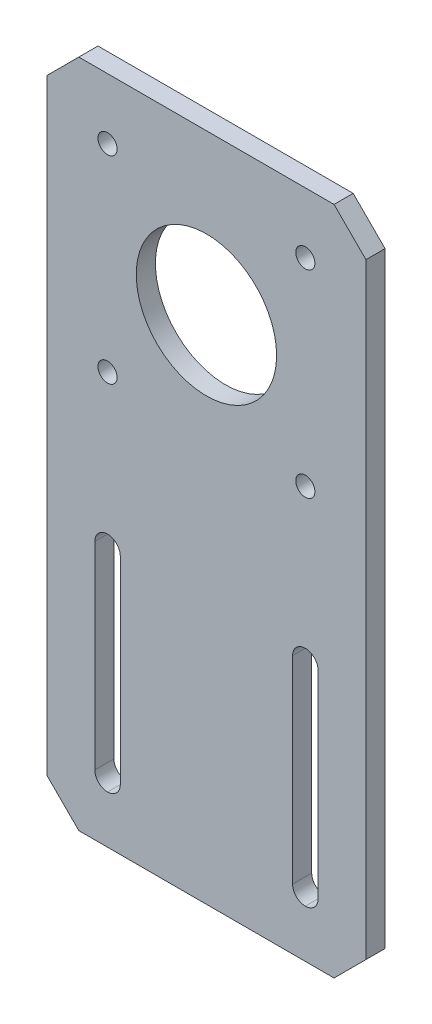
ISO-10303-21;
HEADER;
FILE_DESCRIPTION(('STEP AP214'),'2;1');
FILE_NAME('part.step','',(''),(''),'','','');
FILE_SCHEMA(('AUTOMOTIVE_DESIGN { 1 0 10303 214 1 1 1 1 }'));
ENDSEC;
DATA;
#1=APPLICATION_CONTEXT('core data for automotive mechanical design processes');
#2=APPLICATION_PROTOCOL_DEFINITION('international standard','automotive_design',2000,#1);
#3=PRODUCT_CONTEXT('',#1,'mechanical');
#4=PRODUCT('Part','Part','',(#3));
#5=PRODUCT_RELATED_PRODUCT_CATEGORY('part','',(#4));
#6=PRODUCT_DEFINITION_FORMATION('','',#4);
#7=PRODUCT_DEFINITION_CONTEXT('part definition',#1,'design');
#8=PRODUCT_DEFINITION('design','',#6,#7);
#9=PRODUCT_DEFINITION_SHAPE('','',#8);
#10=(LENGTH_UNIT() NAMED_UNIT(*) SI_UNIT(.MILLI.,.METRE.));
#11=(NAMED_UNIT(*) PLANE_ANGLE_UNIT() SI_UNIT($,.RADIAN.));
#12=(NAMED_UNIT(*) SI_UNIT($,.STERADIAN.) SOLID_ANGLE_UNIT());
#13=UNCERTAINTY_MEASURE_WITH_UNIT(LENGTH_MEASURE(1.E-05),#10,'distance_accuracy_value','');
#14=(GEOMETRIC_REPRESENTATION_CONTEXT(3) GLOBAL_UNCERTAINTY_ASSIGNED_CONTEXT((#13)) GLOBAL_UNIT_ASSIGNED_CONTEXT((#10,
#11,#12)) REPRESENTATION_CONTEXT('',''));
#15=CARTESIAN_POINT('',(0.,0.,0.));
#16=DIRECTION('',(0.,0.,1.));
#17=DIRECTION('',(1.,0.,0.));
#18=AXIS2_PLACEMENT_3D('',#15,#16,#17);
#19=CARTESIAN_POINT('',(0.,0.,3.));
#20=DIRECTION('',(0.,0.,1.));
#21=DIRECTION('',(1.,0.,0.));
#22=AXIS2_PLACEMENT_3D('',#19,#20,#21);
#23=PLANE('',#22);
#24=CARTESIAN_POINT('',(0.,0.,3.));
#25=DIRECTION('',(0.,0.,1.));
#26=DIRECTION('',(1.,0.,0.));
#27=AXIS2_PLACEMENT_3D('',#24,#25,#26);
#28=CIRCLE('',#27,11.);
#29=CARTESIAN_POINT('',(11.,0.,3.));
#30=VERTEX_POINT('',#29);
#31=EDGE_CURVE('E270',#30,#30,#28,.T.);
#32=ORIENTED_EDGE('',*,*,#31,.F.);
#33=EDGE_LOOP('',(#32));
#34=FACE_BOUND('',#33,.T.);
#35=CARTESIAN_POINT('',(15.5,-15.5,3.));
#36=DIRECTION('',(0.,0.,1.));
#37=DIRECTION('',(1.,0.,0.));
#38=AXIS2_PLACEMENT_3D('',#35,#36,#37);
#39=CIRCLE('',#38,1.50000000000013);
#40=CARTESIAN_POINT('',(17.0000000000001,-15.5,3.));
#41=VERTEX_POINT('',#40);
#42=EDGE_CURVE('E306',#41,#41,#39,.T.);
#43=ORIENTED_EDGE('',*,*,#42,.F.);
#44=EDGE_LOOP('',(#43));
#45=FACE_BOUND('',#44,.T.);
#46=CARTESIAN_POINT('',(-15.4999999999991,15.5000000000009,3.));
#47=DIRECTION('',(0.,0.,1.));
#48=DIRECTION('',(1.,0.,0.));
#49=AXIS2_PLACEMENT_3D('',#46,#47,#48);
#50=CIRCLE('',#49,1.49999999999892);
#51=CARTESIAN_POINT('',(-14.0000000000002,15.5000000000009,3.));
#52=VERTEX_POINT('',#51);
#53=EDGE_CURVE('E318',#52,#52,#50,.T.);
#54=ORIENTED_EDGE('',*,*,#53,.F.);
#55=EDGE_LOOP('',(#54));
#56=FACE_BOUND('',#55,.T.);
#57=DIRECTION('',(0.707106781186565,-0.70710678118653,0.));
#58=VECTOR('',#57,1.);
#59=CARTESIAN_POINT('',(-20.,-80.0000000000001,3.));
#60=LINE('',#59,#58);
#61=CARTESIAN_POINT('',(-25.,-75.0000000000003,3.));
#62=VERTEX_POINT('',#61);
#63=CARTESIAN_POINT('',(-20.,-80.0000000000001,3.));
#64=VERTEX_POINT('',#63);
#65=EDGE_CURVE('E187',#62,#64,#60,.T.);
#66=ORIENTED_EDGE('',*,*,#65,.T.);
#67=DIRECTION('',(1.,0.,0.));
#68=VECTOR('',#67,1.);
#69=CARTESIAN_POINT('',(-20.,-80.0000000000001,3.));
#70=LINE('',#69,#68);
#71=CARTESIAN_POINT('',(20.,-80.0000000000001,3.));
#72=VERTEX_POINT('',#71);
#73=EDGE_CURVE('E176',#64,#72,#70,.T.);
#74=ORIENTED_EDGE('',*,*,#73,.T.);
#75=DIRECTION('',(0.707106781186546,0.707106781186549,0.));
#76=VECTOR('',#75,1.);
#77=CARTESIAN_POINT('',(20.,-80.0000000000001,3.));
#78=LINE('',#77,#76);
#79=CARTESIAN_POINT('',(24.9999999999999,-75.0000000000001,3.));
#80=VERTEX_POINT('',#79);
#81=EDGE_CURVE('E186',#72,#80,#78,.T.);
#82=ORIENTED_EDGE('',*,*,#81,.T.);
#83=DIRECTION('',(0.,1.,0.));
#84=VECTOR('',#83,1.);
#85=CARTESIAN_POINT('',(24.9999999999999,-75.0000000000001,3.));
#86=LINE('',#85,#84);
#87=CARTESIAN_POINT('',(25.,20.0000000000001,3.));
#88=VERTEX_POINT('',#87);
#89=EDGE_CURVE('E324',#80,#88,#86,.T.);
#90=ORIENTED_EDGE('',*,*,#89,.T.);
#91=DIRECTION('',(-0.707106781186556,0.707106781186539,0.));
#92=VECTOR('',#91,1.);
#93=CARTESIAN_POINT('',(20.,25.,3.));
#94=LINE('',#93,#92);
#95=CARTESIAN_POINT('',(20.,25.,3.));
#96=VERTEX_POINT('',#95);
#97=EDGE_CURVE('E326',#88,#96,#94,.T.);
#98=ORIENTED_EDGE('',*,*,#97,.T.);
#99=DIRECTION('',(-1.,0.,0.));
#100=VECTOR('',#99,1.);
#101=CARTESIAN_POINT('',(-20.,25.,3.));
#102=LINE('',#101,#100);
#103=CARTESIAN_POINT('',(-20.,25.,3.));
#104=VERTEX_POINT('',#103);
#105=EDGE_CURVE('E328',#96,#104,#102,.T.);
#106=ORIENTED_EDGE('',*,*,#105,.T.);
#107=DIRECTION('',(-0.707106781186542,-0.707106781186553,0.));
#108=VECTOR('',#107,1.);
#109=CARTESIAN_POINT('',(-20.,25.,3.));
#110=LINE('',#109,#108);
#111=CARTESIAN_POINT('',(-25.,19.9999999999999,3.));
#112=VERTEX_POINT('',#111);
#113=EDGE_CURVE('E330',#104,#112,#110,.T.);
#114=ORIENTED_EDGE('',*,*,#113,.T.);
#115=DIRECTION('',(0.,-1.,0.));
#116=VECTOR('',#115,1.);
#117=CARTESIAN_POINT('',(-25.,19.9999999999999,3.));
#118=LINE('',#117,#116);
#119=EDGE_CURVE('E192',#112,#62,#118,.T.);
#120=ORIENTED_EDGE('',*,*,#119,.T.);
#121=EDGE_LOOP('',(#66,#74,#82,#90,#98,#106,#114,#120));
#122=FACE_BOUND('',#121,.T.);
#123=CARTESIAN_POINT('',(15.5000000000009,15.5,3.));
#124=DIRECTION('',(0.,0.,1.));
#125=DIRECTION('',(1.,0.,0.));
#126=AXIS2_PLACEMENT_3D('',#123,#124,#125);
#127=CIRCLE('',#126,1.49999999999981);
#128=CARTESIAN_POINT('',(17.0000000000007,15.5,3.));
#129=VERTEX_POINT('',#128);
#130=EDGE_CURVE('E312',#129,#129,#127,.T.);
#131=ORIENTED_EDGE('',*,*,#130,.F.);
#132=EDGE_LOOP('',(#131));
#133=FACE_BOUND('',#132,.T.);
#134=CARTESIAN_POINT('',(-15.5,-15.4999999999991,3.));
#135=DIRECTION('',(0.,0.,1.));
#136=DIRECTION('',(1.,0.,0.));
#137=AXIS2_PLACEMENT_3D('',#134,#135,#136);
#138=CIRCLE('',#137,1.49999999999938);
#139=CARTESIAN_POINT('',(-14.0000000000006,-15.4999999999991,3.));
#140=VERTEX_POINT('',#139);
#141=EDGE_CURVE('E300',#140,#140,#138,.T.);
#142=ORIENTED_EDGE('',*,*,#141,.F.);
#143=EDGE_LOOP('',(#142));
#144=FACE_BOUND('',#143,.T.);
#145=CARTESIAN_POINT('',(-15.5,-39.5,3.));
#146=DIRECTION('',(0.,0.,1.));
#147=DIRECTION('',(1.,0.,0.));
#148=AXIS2_PLACEMENT_3D('',#145,#146,#147);
#149=CIRCLE('',#148,2.);
#150=CARTESIAN_POINT('',(-17.5,-39.5,3.));
#151=VERTEX_POINT('',#150);
#152=CARTESIAN_POINT('',(-15.5,-37.5,3.));
#153=VERTEX_POINT('',#152);
#154=EDGE_CURVE('E54',#151,#153,#149,.F.);
#155=ORIENTED_EDGE('',*,*,#154,.T.);
#156=CARTESIAN_POINT('',(-15.5,-39.5,3.));
#157=DIRECTION('',(0.,0.,1.));
#158=DIRECTION('',(1.,0.,0.));
#159=AXIS2_PLACEMENT_3D('',#156,#157,#158);
#160=CIRCLE('',#159,2.);
#161=CARTESIAN_POINT('',(-13.5,-39.5,3.));
#162=VERTEX_POINT('',#161);
#163=EDGE_CURVE('E11',#153,#162,#160,.F.);
#164=ORIENTED_EDGE('',*,*,#163,.T.);
#165=DIRECTION('',(0.,1.,0.));
#166=VECTOR('',#165,1.);
#167=CARTESIAN_POINT('',(-13.5,-37.5,3.));
#168=LINE('',#167,#166);
#169=CARTESIAN_POINT('',(-13.5,-70.5,3.));
#170=VERTEX_POINT('',#169);
#171=EDGE_CURVE('E292',#170,#162,#168,.T.);
#172=ORIENTED_EDGE('',*,*,#171,.F.);
#173=CARTESIAN_POINT('',(-15.5,-70.5,3.));
#174=DIRECTION('',(0.,0.,1.));
#175=DIRECTION('',(1.,0.,0.));
#176=AXIS2_PLACEMENT_3D('',#173,#174,#175);
#177=CIRCLE('',#176,2.);
#178=CARTESIAN_POINT('',(-15.5,-72.5,3.));
#179=VERTEX_POINT('',#178);
#180=EDGE_CURVE('E232',#170,#179,#177,.F.);
#181=ORIENTED_EDGE('',*,*,#180,.T.);
#182=CARTESIAN_POINT('',(-15.5,-70.5,3.));
#183=DIRECTION('',(0.,0.,1.));
#184=DIRECTION('',(1.,0.,0.));
#185=AXIS2_PLACEMENT_3D('',#182,#183,#184);
#186=CIRCLE('',#185,2.);
#187=CARTESIAN_POINT('',(-17.5,-70.5,3.));
#188=VERTEX_POINT('',#187);
#189=EDGE_CURVE('E243',#179,#188,#186,.F.);
#190=ORIENTED_EDGE('',*,*,#189,.T.);
#191=DIRECTION('',(0.,-1.,0.));
#192=VECTOR('',#191,1.);
#193=CARTESIAN_POINT('',(-17.5,-37.5,3.));
#194=LINE('',#193,#192);
#195=EDGE_CURVE('E289',#151,#188,#194,.T.);
#196=ORIENTED_EDGE('',*,*,#195,.F.);
#197=EDGE_LOOP('',(#155,#164,#172,#181,#190,#196));
#198=FACE_BOUND('',#197,.T.);
#199=CARTESIAN_POINT('',(15.5,-70.5,3.));
#200=DIRECTION('',(0.,0.,1.));
#201=DIRECTION('',(1.,0.,0.));
#202=AXIS2_PLACEMENT_3D('',#199,#200,#201);
#203=CIRCLE('',#202,2.);
#204=CARTESIAN_POINT('',(17.5,-70.5,3.));
#205=VERTEX_POINT('',#204);
#206=CARTESIAN_POINT('',(15.5,-72.5,3.));
#207=VERTEX_POINT('',#206);
#208=EDGE_CURVE('E228',#205,#207,#203,.F.);
#209=ORIENTED_EDGE('',*,*,#208,.T.);
#210=CARTESIAN_POINT('',(15.5,-70.5,3.));
#211=DIRECTION('',(0.,0.,1.));
#212=DIRECTION('',(1.,0.,0.));
#213=AXIS2_PLACEMENT_3D('',#210,#211,#212);
#214=CIRCLE('',#213,2.);
#215=CARTESIAN_POINT('',(13.5,-70.5,3.));
#216=VERTEX_POINT('',#215);
#217=EDGE_CURVE('E247',#207,#216,#214,.F.);
#218=ORIENTED_EDGE('',*,*,#217,.T.);
#219=DIRECTION('',(0.,-1.,0.));
#220=VECTOR('',#219,1.);
#221=CARTESIAN_POINT('',(13.5,-37.5,3.));
#222=LINE('',#221,#220);
#223=CARTESIAN_POINT('',(13.5,-39.5,3.));
#224=VERTEX_POINT('',#223);
#225=EDGE_CURVE('E280',#224,#216,#222,.T.);
#226=ORIENTED_EDGE('',*,*,#225,.F.);
#227=CARTESIAN_POINT('',(15.5,-39.5,3.));
#228=DIRECTION('',(0.,0.,1.));
#229=DIRECTION('',(1.,0.,0.));
#230=AXIS2_PLACEMENT_3D('',#227,#228,#229);
#231=CIRCLE('',#230,2.);
#232=CARTESIAN_POINT('',(15.5,-37.5,3.));
#233=VERTEX_POINT('',#232);
#234=EDGE_CURVE('E236',#224,#233,#231,.F.);
#235=ORIENTED_EDGE('',*,*,#234,.T.);
#236=CARTESIAN_POINT('',(15.5,-39.5,3.));
#237=DIRECTION('',(0.,0.,1.));
#238=DIRECTION('',(1.,0.,0.));
#239=AXIS2_PLACEMENT_3D('',#236,#237,#238);
#240=CIRCLE('',#239,2.);
#241=CARTESIAN_POINT('',(17.5,-39.5,3.));
#242=VERTEX_POINT('',#241);
#243=EDGE_CURVE('E251',#233,#242,#240,.F.);
#244=ORIENTED_EDGE('',*,*,#243,.T.);
#245=DIRECTION('',(0.,1.,0.));
#246=VECTOR('',#245,1.);
#247=CARTESIAN_POINT('',(17.5,-72.5,3.));
#248=LINE('',#247,#246);
#249=EDGE_CURVE('E277',#205,#242,#248,.T.);
#250=ORIENTED_EDGE('',*,*,#249,.F.);
#251=EDGE_LOOP('',(#209,#218,#226,#235,#244,#250));
#252=FACE_BOUND('',#251,.T.);
#253=ADVANCED_FACE('F38',(#34,#45,#56,#122,#133,#144,#198,#252),#23,.T.);
#254=CARTESIAN_POINT('',(0.,0.,0.));
#255=DIRECTION('',(0.,0.,1.));
#256=DIRECTION('',(1.,0.,0.));
#257=AXIS2_PLACEMENT_3D('',#254,#255,#256);
#258=PLANE('',#257);
#259=CARTESIAN_POINT('',(0.,0.,0.));
#260=DIRECTION('',(0.,0.,1.));
#261=DIRECTION('',(1.,0.,0.));
#262=AXIS2_PLACEMENT_3D('',#259,#260,#261);
#263=CIRCLE('',#262,11.);
#264=CARTESIAN_POINT('',(11.,0.,0.));
#265=VERTEX_POINT('',#264);
#266=EDGE_CURVE('E266',#265,#265,#263,.T.);
#267=ORIENTED_EDGE('',*,*,#266,.T.);
#268=EDGE_LOOP('',(#267));
#269=FACE_BOUND('',#268,.T.);
#270=DIRECTION('',(0.,1.,0.));
#271=VECTOR('',#270,1.);
#272=CARTESIAN_POINT('',(-13.5,-37.5,0.));
#273=LINE('',#272,#271);
#274=CARTESIAN_POINT('',(-13.5,-70.5,0.));
#275=VERTEX_POINT('',#274);
#276=CARTESIAN_POINT('',(-13.5,-39.5,0.));
#277=VERTEX_POINT('',#276);
#278=EDGE_CURVE('E293',#275,#277,#273,.T.);
#279=ORIENTED_EDGE('',*,*,#278,.T.);
#280=CARTESIAN_POINT('',(-15.5,-39.5,0.));
#281=DIRECTION('',(0.,0.,1.));
#282=DIRECTION('',(1.,0.,0.));
#283=AXIS2_PLACEMENT_3D('',#280,#281,#282);
#284=CIRCLE('',#283,2.);
#285=CARTESIAN_POINT('',(-15.5,-37.5,0.));
#286=VERTEX_POINT('',#285);
#287=EDGE_CURVE('E47',#277,#286,#284,.T.);
#288=ORIENTED_EDGE('',*,*,#287,.T.);
#289=CARTESIAN_POINT('',(-15.5,-39.5,0.));
#290=DIRECTION('',(0.,0.,1.));
#291=DIRECTION('',(1.,0.,0.));
#292=AXIS2_PLACEMENT_3D('',#289,#290,#291);
#293=CIRCLE('',#292,2.);
#294=CARTESIAN_POINT('',(-17.5,-39.5,0.));
#295=VERTEX_POINT('',#294);
#296=EDGE_CURVE('E238',#286,#295,#293,.T.);
#297=ORIENTED_EDGE('',*,*,#296,.T.);
#298=DIRECTION('',(0.,-1.,0.));
#299=VECTOR('',#298,1.);
#300=CARTESIAN_POINT('',(-17.5,-37.5,0.));
#301=LINE('',#300,#299);
#302=CARTESIAN_POINT('',(-17.5,-70.5,0.));
#303=VERTEX_POINT('',#302);
#304=EDGE_CURVE('E284',#295,#303,#301,.T.);
#305=ORIENTED_EDGE('',*,*,#304,.T.);
#306=CARTESIAN_POINT('',(-15.5,-70.5,0.));
#307=DIRECTION('',(0.,0.,1.));
#308=DIRECTION('',(1.,0.,0.));
#309=AXIS2_PLACEMENT_3D('',#306,#307,#308);
#310=CIRCLE('',#309,2.);
#311=CARTESIAN_POINT('',(-15.5,-72.5,0.));
#312=VERTEX_POINT('',#311);
#313=EDGE_CURVE('E241',#303,#312,#310,.T.);
#314=ORIENTED_EDGE('',*,*,#313,.T.);
#315=CARTESIAN_POINT('',(-15.5,-70.5,0.));
#316=DIRECTION('',(0.,0.,1.));
#317=DIRECTION('',(1.,0.,0.));
#318=AXIS2_PLACEMENT_3D('',#315,#316,#317);
#319=CIRCLE('',#318,2.);
#320=EDGE_CURVE('E230',#312,#275,#319,.T.);
#321=ORIENTED_EDGE('',*,*,#320,.T.);
#322=EDGE_LOOP('',(#279,#288,#297,#305,#314,#321));
#323=FACE_BOUND('',#322,.T.);
#324=DIRECTION('',(0.707106781186565,-0.70710678118653,0.));
#325=VECTOR('',#324,1.);
#326=CARTESIAN_POINT('',(-20.,-80.0000000000001,0.));
#327=LINE('',#326,#325);
#328=CARTESIAN_POINT('',(-25.,-75.0000000000003,0.));
#329=VERTEX_POINT('',#328);
#330=CARTESIAN_POINT('',(-20.,-80.0000000000001,0.));
#331=VERTEX_POINT('',#330);
#332=EDGE_CURVE('E200',#329,#331,#327,.T.);
#333=ORIENTED_EDGE('',*,*,#332,.F.);
#334=DIRECTION('',(0.,-1.,0.));
#335=VECTOR('',#334,1.);
#336=CARTESIAN_POINT('',(-25.,19.9999999999999,0.));
#337=LINE('',#336,#335);
#338=CARTESIAN_POINT('',(-25.,19.9999999999999,0.));
#339=VERTEX_POINT('',#338);
#340=EDGE_CURVE('E196',#339,#329,#337,.T.);
#341=ORIENTED_EDGE('',*,*,#340,.F.);
#342=DIRECTION('',(-0.707106781186542,-0.707106781186553,0.));
#343=VECTOR('',#342,1.);
#344=CARTESIAN_POINT('',(-20.,25.,0.));
#345=LINE('',#344,#343);
#346=CARTESIAN_POINT('',(-20.,25.,0.));
#347=VERTEX_POINT('',#346);
#348=EDGE_CURVE('E345',#347,#339,#345,.T.);
#349=ORIENTED_EDGE('',*,*,#348,.F.);
#350=DIRECTION('',(-1.,0.,0.));
#351=VECTOR('',#350,1.);
#352=CARTESIAN_POINT('',(-20.,25.,0.));
#353=LINE('',#352,#351);
#354=CARTESIAN_POINT('',(20.,25.,0.));
#355=VERTEX_POINT('',#354);
#356=EDGE_CURVE('E343',#355,#347,#353,.T.);
#357=ORIENTED_EDGE('',*,*,#356,.F.);
#358=DIRECTION('',(-0.707106781186556,0.707106781186539,0.));
#359=VECTOR('',#358,1.);
#360=CARTESIAN_POINT('',(20.,25.,0.));
#361=LINE('',#360,#359);
#362=CARTESIAN_POINT('',(25.,20.0000000000001,0.));
#363=VERTEX_POINT('',#362);
#364=EDGE_CURVE('E341',#363,#355,#361,.T.);
#365=ORIENTED_EDGE('',*,*,#364,.F.);
#366=DIRECTION('',(0.,1.,0.));
#367=VECTOR('',#366,1.);
#368=CARTESIAN_POINT('',(24.9999999999999,-75.0000000000001,0.));
#369=LINE('',#368,#367);
#370=CARTESIAN_POINT('',(24.9999999999999,-75.0000000000001,0.));
#371=VERTEX_POINT('',#370);
#372=EDGE_CURVE('E339',#371,#363,#369,.T.);
#373=ORIENTED_EDGE('',*,*,#372,.F.);
#374=DIRECTION('',(0.707106781186546,0.707106781186549,0.));
#375=VECTOR('',#374,1.);
#376=CARTESIAN_POINT('',(20.,-80.0000000000001,0.));
#377=LINE('',#376,#375);
#378=CARTESIAN_POINT('',(20.,-80.0000000000001,0.));
#379=VERTEX_POINT('',#378);
#380=EDGE_CURVE('E337',#379,#371,#377,.T.);
#381=ORIENTED_EDGE('',*,*,#380,.F.);
#382=DIRECTION('',(1.,0.,0.));
#383=VECTOR('',#382,1.);
#384=CARTESIAN_POINT('',(-20.,-80.0000000000001,0.));
#385=LINE('',#384,#383);
#386=EDGE_CURVE('E335',#331,#379,#385,.T.);
#387=ORIENTED_EDGE('',*,*,#386,.F.);
#388=EDGE_LOOP('',(#333,#341,#349,#357,#365,#373,#381,#387));
#389=FACE_BOUND('',#388,.T.);
#390=CARTESIAN_POINT('',(-15.4999999999991,15.5000000000009,0.));
#391=DIRECTION('',(0.,0.,1.));
#392=DIRECTION('',(1.,0.,0.));
#393=AXIS2_PLACEMENT_3D('',#390,#391,#392);
#394=CIRCLE('',#393,1.49999999999892);
#395=CARTESIAN_POINT('',(-14.0000000000002,15.5000000000009,0.));
#396=VERTEX_POINT('',#395);
#397=EDGE_CURVE('E315',#396,#396,#394,.T.);
#398=ORIENTED_EDGE('',*,*,#397,.T.);
#399=EDGE_LOOP('',(#398));
#400=FACE_BOUND('',#399,.T.);
#401=CARTESIAN_POINT('',(15.5000000000009,15.5,0.));
#402=DIRECTION('',(0.,0.,1.));
#403=DIRECTION('',(1.,0.,0.));
#404=AXIS2_PLACEMENT_3D('',#401,#402,#403);
#405=CIRCLE('',#404,1.49999999999981);
#406=CARTESIAN_POINT('',(17.0000000000007,15.5,0.));
#407=VERTEX_POINT('',#406);
#408=EDGE_CURVE('E309',#407,#407,#405,.T.);
#409=ORIENTED_EDGE('',*,*,#408,.T.);
#410=EDGE_LOOP('',(#409));
#411=FACE_BOUND('',#410,.T.);
#412=CARTESIAN_POINT('',(15.5,-15.5,0.));
#413=DIRECTION('',(0.,0.,1.));
#414=DIRECTION('',(1.,0.,0.));
#415=AXIS2_PLACEMENT_3D('',#412,#413,#414);
#416=CIRCLE('',#415,1.50000000000013);
#417=CARTESIAN_POINT('',(17.0000000000001,-15.5,0.));
#418=VERTEX_POINT('',#417);
#419=EDGE_CURVE('E303',#418,#418,#416,.T.);
#420=ORIENTED_EDGE('',*,*,#419,.T.);
#421=EDGE_LOOP('',(#420));
#422=FACE_BOUND('',#421,.T.);
#423=CARTESIAN_POINT('',(-15.5,-15.4999999999991,0.));
#424=DIRECTION('',(0.,0.,1.));
#425=DIRECTION('',(1.,0.,0.));
#426=AXIS2_PLACEMENT_3D('',#423,#424,#425);
#427=CIRCLE('',#426,1.49999999999938);
#428=CARTESIAN_POINT('',(-14.0000000000006,-15.4999999999991,0.));
#429=VERTEX_POINT('',#428);
#430=EDGE_CURVE('E296',#429,#429,#427,.T.);
#431=ORIENTED_EDGE('',*,*,#430,.T.);
#432=EDGE_LOOP('',(#431));
#433=FACE_BOUND('',#432,.T.);
#434=DIRECTION('',(0.,-1.,0.));
#435=VECTOR('',#434,1.);
#436=CARTESIAN_POINT('',(13.5,-37.5,0.));
#437=LINE('',#436,#435);
#438=CARTESIAN_POINT('',(13.5,-39.5,0.));
#439=VERTEX_POINT('',#438);
#440=CARTESIAN_POINT('',(13.5,-70.5,0.));
#441=VERTEX_POINT('',#440);
#442=EDGE_CURVE('E281',#439,#441,#437,.T.);
#443=ORIENTED_EDGE('',*,*,#442,.T.);
#444=CARTESIAN_POINT('',(15.5,-70.5,0.));
#445=DIRECTION('',(0.,0.,1.));
#446=DIRECTION('',(1.,0.,0.));
#447=AXIS2_PLACEMENT_3D('',#444,#445,#446);
#448=CIRCLE('',#447,2.);
#449=CARTESIAN_POINT('',(15.5,-72.5,0.));
#450=VERTEX_POINT('',#449);
#451=EDGE_CURVE('E245',#441,#450,#448,.T.);
#452=ORIENTED_EDGE('',*,*,#451,.T.);
#453=CARTESIAN_POINT('',(15.5,-70.5,0.));
#454=DIRECTION('',(0.,0.,1.));
#455=DIRECTION('',(1.,0.,0.));
#456=AXIS2_PLACEMENT_3D('',#453,#454,#455);
#457=CIRCLE('',#456,2.);
#458=CARTESIAN_POINT('',(17.5,-70.5,0.));
#459=VERTEX_POINT('',#458);
#460=EDGE_CURVE('E226',#450,#459,#457,.T.);
#461=ORIENTED_EDGE('',*,*,#460,.T.);
#462=DIRECTION('',(0.,1.,0.));
#463=VECTOR('',#462,1.);
#464=CARTESIAN_POINT('',(17.5,-72.5,0.));
#465=LINE('',#464,#463);
#466=CARTESIAN_POINT('',(17.5,-39.5,0.));
#467=VERTEX_POINT('',#466);
#468=EDGE_CURVE('E257',#459,#467,#465,.T.);
#469=ORIENTED_EDGE('',*,*,#468,.T.);
#470=CARTESIAN_POINT('',(15.5,-39.5,0.));
#471=DIRECTION('',(0.,0.,1.));
#472=DIRECTION('',(1.,0.,0.));
#473=AXIS2_PLACEMENT_3D('',#470,#471,#472);
#474=CIRCLE('',#473,2.);
#475=CARTESIAN_POINT('',(15.5,-37.5,0.));
#476=VERTEX_POINT('',#475);
#477=EDGE_CURVE('E249',#467,#476,#474,.T.);
#478=ORIENTED_EDGE('',*,*,#477,.T.);
#479=CARTESIAN_POINT('',(15.5,-39.5,0.));
#480=DIRECTION('',(0.,0.,1.));
#481=DIRECTION('',(1.,0.,0.));
#482=AXIS2_PLACEMENT_3D('',#479,#480,#481);
#483=CIRCLE('',#482,2.);
#484=EDGE_CURVE('E234',#476,#439,#483,.T.);
#485=ORIENTED_EDGE('',*,*,#484,.T.);
#486=EDGE_LOOP('',(#443,#452,#461,#469,#478,#485));
#487=FACE_BOUND('',#486,.T.);
#488=ADVANCED_FACE('F371',(#269,#323,#389,#400,#411,#422,#433,#487),#258,.F.);
#489=CARTESIAN_POINT('',(-20.,-80.0000000000001,3.));
#490=DIRECTION('',(0.70710678118653,0.707106781186565,0.));
#491=DIRECTION('',(-0.707106781186565,0.70710678118653,0.));
#492=AXIS2_PLACEMENT_3D('',#489,#490,#491);
#493=PLANE('',#492);
#494=ORIENTED_EDGE('',*,*,#332,.T.);
#495=DIRECTION('',(0.,0.,-1.));
#496=VECTOR('',#495,1.);
#497=CARTESIAN_POINT('',(-20.,-80.0000000000001,3.));
#498=LINE('',#497,#496);
#499=EDGE_CURVE('E180',#64,#331,#498,.T.);
#500=ORIENTED_EDGE('',*,*,#499,.F.);
#501=ORIENTED_EDGE('',*,*,#65,.F.);
#502=DIRECTION('',(0.,0.,-1.));
#503=VECTOR('',#502,1.);
#504=CARTESIAN_POINT('',(-25.,-75.0000000000003,3.));
#505=LINE('',#504,#503);
#506=EDGE_CURVE('E333',#62,#329,#505,.T.);
#507=ORIENTED_EDGE('',*,*,#506,.T.);
#508=EDGE_LOOP('',(#494,#500,#501,#507));
#509=FACE_BOUND('',#508,.T.);
#510=ADVANCED_FACE('F198',(#509),#493,.F.);
#511=CARTESIAN_POINT('',(-20.,-80.0000000000001,3.));
#512=DIRECTION('',(0.,1.,0.));
#513=DIRECTION('',(0.,0.,1.));
#514=AXIS2_PLACEMENT_3D('',#511,#512,#513);
#515=PLANE('',#514);
#516=ORIENTED_EDGE('',*,*,#386,.T.);
#517=DIRECTION('',(0.,0.,-1.));
#518=VECTOR('',#517,1.);
#519=CARTESIAN_POINT('',(20.,-80.0000000000001,3.));
#520=LINE('',#519,#518);
#521=EDGE_CURVE('E183',#72,#379,#520,.T.);
#522=ORIENTED_EDGE('',*,*,#521,.F.);
#523=ORIENTED_EDGE('',*,*,#73,.F.);
#524=ORIENTED_EDGE('',*,*,#499,.T.);
#525=EDGE_LOOP('',(#516,#522,#523,#524));
#526=FACE_BOUND('',#525,.T.);
#527=ADVANCED_FACE('F178',(#526),#515,.F.);
#528=CARTESIAN_POINT('',(20.,-80.0000000000001,3.));
#529=DIRECTION('',(-0.707106781186549,0.707106781186546,0.));
#530=DIRECTION('',(-0.707106781186546,-0.707106781186549,0.));
#531=AXIS2_PLACEMENT_3D('',#528,#529,#530);
#532=PLANE('',#531);
#533=ORIENTED_EDGE('',*,*,#380,.T.);
#534=DIRECTION('',(0.,0.,-1.));
#535=VECTOR('',#534,1.);
#536=CARTESIAN_POINT('',(24.9999999999999,-75.0000000000001,3.));
#537=LINE('',#536,#535);
#538=EDGE_CURVE('E205',#80,#371,#537,.T.);
#539=ORIENTED_EDGE('',*,*,#538,.F.);
#540=ORIENTED_EDGE('',*,*,#81,.F.);
#541=ORIENTED_EDGE('',*,*,#521,.T.);
#542=EDGE_LOOP('',(#533,#539,#540,#541));
#543=FACE_BOUND('',#542,.T.);
#544=ADVANCED_FACE('F385',(#543),#532,.F.);
#545=CARTESIAN_POINT('',(24.9999999999999,-75.0000000000001,3.));
#546=DIRECTION('',(-1.,0.,0.));
#547=DIRECTION('',(0.,-1.,0.));
#548=AXIS2_PLACEMENT_3D('',#545,#546,#547);
#549=PLANE('',#548);
#550=ORIENTED_EDGE('',*,*,#372,.T.);
#551=DIRECTION('',(0.,0.,-1.));
#552=VECTOR('',#551,1.);
#553=CARTESIAN_POINT('',(25.,20.0000000000001,3.));
#554=LINE('',#553,#552);
#555=EDGE_CURVE('E358',#88,#363,#554,.T.);
#556=ORIENTED_EDGE('',*,*,#555,.F.);
#557=ORIENTED_EDGE('',*,*,#89,.F.);
#558=ORIENTED_EDGE('',*,*,#538,.T.);
#559=EDGE_LOOP('',(#550,#556,#557,#558));
#560=FACE_BOUND('',#559,.T.);
#561=ADVANCED_FACE('F365',(#560),#549,.F.);
#562=CARTESIAN_POINT('',(20.,25.,3.));
#563=DIRECTION('',(-0.707106781186539,-0.707106781186556,0.));
#564=DIRECTION('',(0.707106781186556,-0.707106781186539,0.));
#565=AXIS2_PLACEMENT_3D('',#562,#563,#564);
#566=PLANE('',#565);
#567=ORIENTED_EDGE('',*,*,#364,.T.);
#568=DIRECTION('',(0.,0.,-1.));
#569=VECTOR('',#568,1.);
#570=CARTESIAN_POINT('',(20.,25.,3.));
#571=LINE('',#570,#569);
#572=EDGE_CURVE('E355',#96,#355,#571,.T.);
#573=ORIENTED_EDGE('',*,*,#572,.F.);
#574=ORIENTED_EDGE('',*,*,#97,.F.);
#575=ORIENTED_EDGE('',*,*,#555,.T.);
#576=EDGE_LOOP('',(#567,#573,#574,#575));
#577=FACE_BOUND('',#576,.T.);
#578=ADVANCED_FACE('F377',(#577),#566,.F.);
#579=CARTESIAN_POINT('',(-20.,25.,3.));
#580=DIRECTION('',(0.,-1.,0.));
#581=DIRECTION('',(0.,0.,-1.));
#582=AXIS2_PLACEMENT_3D('',#579,#580,#581);
#583=PLANE('',#582);
#584=ORIENTED_EDGE('',*,*,#356,.T.);
#585=DIRECTION('',(0.,0.,-1.));
#586=VECTOR('',#585,1.);
#587=CARTESIAN_POINT('',(-20.,25.,3.));
#588=LINE('',#587,#586);
#589=EDGE_CURVE('E352',#104,#347,#588,.T.);
#590=ORIENTED_EDGE('',*,*,#589,.F.);
#591=ORIENTED_EDGE('',*,*,#105,.F.);
#592=ORIENTED_EDGE('',*,*,#572,.T.);
#593=EDGE_LOOP('',(#584,#590,#591,#592));
#594=FACE_BOUND('',#593,.T.);
#595=ADVANCED_FACE('F381',(#594),#583,.F.);
#596=CARTESIAN_POINT('',(-20.,25.,3.));
#597=DIRECTION('',(0.707106781186553,-0.707106781186542,0.));
#598=DIRECTION('',(0.707106781186542,0.707106781186553,0.));
#599=AXIS2_PLACEMENT_3D('',#596,#597,#598);
#600=PLANE('',#599);
#601=ORIENTED_EDGE('',*,*,#348,.T.);
#602=DIRECTION('',(0.,0.,-1.));
#603=VECTOR('',#602,1.);
#604=CARTESIAN_POINT('',(-25.,19.9999999999999,3.));
#605=LINE('',#604,#603);
#606=EDGE_CURVE('E349',#112,#339,#605,.T.);
#607=ORIENTED_EDGE('',*,*,#606,.F.);
#608=ORIENTED_EDGE('',*,*,#113,.F.);
#609=ORIENTED_EDGE('',*,*,#589,.T.);
#610=EDGE_LOOP('',(#601,#607,#608,#609));
#611=FACE_BOUND('',#610,.T.);
#612=ADVANCED_FACE('F410',(#611),#600,.F.);
#613=CARTESIAN_POINT('',(-25.,19.9999999999999,3.));
#614=DIRECTION('',(1.,0.,0.));
#615=DIRECTION('',(0.,1.,0.));
#616=AXIS2_PLACEMENT_3D('',#613,#614,#615);
#617=PLANE('',#616);
#618=ORIENTED_EDGE('',*,*,#340,.T.);
#619=ORIENTED_EDGE('',*,*,#506,.F.);
#620=ORIENTED_EDGE('',*,*,#119,.F.);
#621=ORIENTED_EDGE('',*,*,#606,.T.);
#622=EDGE_LOOP('',(#618,#619,#620,#621));
#623=FACE_BOUND('',#622,.T.);
#624=ADVANCED_FACE('F407',(#623),#617,.F.);
#625=CARTESIAN_POINT('',(-15.4999999999991,15.5000000000009,3.));
#626=DIRECTION('',(0.,0.,-1.));
#627=DIRECTION('',(-1.,0.,0.));
#628=AXIS2_PLACEMENT_3D('',#625,#626,#627);
#629=CYLINDRICAL_SURFACE('',#628,1.49999999999892);
#630=ORIENTED_EDGE('',*,*,#53,.T.);
#631=EDGE_LOOP('',(#630));
#632=FACE_BOUND('',#631,.T.);
#633=ORIENTED_EDGE('',*,*,#397,.F.);
#634=EDGE_LOOP('',(#633));
#635=FACE_BOUND('',#634,.T.);
#636=ADVANCED_FACE('F404',(#632,#635),#629,.F.);
#637=CARTESIAN_POINT('',(15.5000000000009,15.5,3.));
#638=DIRECTION('',(0.,0.,-1.));
#639=DIRECTION('',(-1.,0.,0.));
#640=AXIS2_PLACEMENT_3D('',#637,#638,#639);
#641=CYLINDRICAL_SURFACE('',#640,1.49999999999981);
#642=ORIENTED_EDGE('',*,*,#130,.T.);
#643=EDGE_LOOP('',(#642));
#644=FACE_BOUND('',#643,.T.);
#645=ORIENTED_EDGE('',*,*,#408,.F.);
#646=EDGE_LOOP('',(#645));
#647=FACE_BOUND('',#646,.T.);
#648=ADVANCED_FACE('F440',(#644,#647),#641,.F.);
#649=CARTESIAN_POINT('',(15.5,-15.5,3.));
#650=DIRECTION('',(0.,0.,-1.));
#651=DIRECTION('',(-1.,0.,0.));
#652=AXIS2_PLACEMENT_3D('',#649,#650,#651);
#653=CYLINDRICAL_SURFACE('',#652,1.50000000000013);
#654=ORIENTED_EDGE('',*,*,#42,.T.);
#655=EDGE_LOOP('',(#654));
#656=FACE_BOUND('',#655,.T.);
#657=ORIENTED_EDGE('',*,*,#419,.F.);
#658=EDGE_LOOP('',(#657));
#659=FACE_BOUND('',#658,.T.);
#660=ADVANCED_FACE('F447',(#656,#659),#653,.F.);
#661=CARTESIAN_POINT('',(-15.5,-15.4999999999991,3.));
#662=DIRECTION('',(0.,0.,-1.));
#663=DIRECTION('',(-1.,0.,0.));
#664=AXIS2_PLACEMENT_3D('',#661,#662,#663);
#665=CYLINDRICAL_SURFACE('',#664,1.49999999999938);
#666=ORIENTED_EDGE('',*,*,#141,.T.);
#667=EDGE_LOOP('',(#666));
#668=FACE_BOUND('',#667,.T.);
#669=ORIENTED_EDGE('',*,*,#430,.F.);
#670=EDGE_LOOP('',(#669));
#671=FACE_BOUND('',#670,.T.);
#672=ADVANCED_FACE('F454',(#668,#671),#665,.F.);
#673=CARTESIAN_POINT('',(-17.5,-37.5,3.));
#674=DIRECTION('',(1.,0.,0.));
#675=DIRECTION('',(0.,0.,-1.));
#676=AXIS2_PLACEMENT_3D('',#673,#674,#675);
#677=PLANE('',#676);
#678=ORIENTED_EDGE('',*,*,#304,.F.);
#679=DIRECTION('',(0.,0.,-1.));
#680=VECTOR('',#679,1.);
#681=CARTESIAN_POINT('',(-17.5,-39.5,3.));
#682=LINE('',#681,#680);
#683=EDGE_CURVE('E223',#295,#151,#682,.F.);
#684=ORIENTED_EDGE('',*,*,#683,.T.);
#685=ORIENTED_EDGE('',*,*,#195,.T.);
#686=DIRECTION('',(0.,0.,-1.));
#687=VECTOR('',#686,1.);
#688=CARTESIAN_POINT('',(-17.5,-70.5,0.));
#689=LINE('',#688,#687);
#690=EDGE_CURVE('E221',#188,#303,#689,.T.);
#691=ORIENTED_EDGE('',*,*,#690,.T.);
#692=EDGE_LOOP('',(#678,#684,#685,#691));
#693=FACE_BOUND('',#692,.T.);
#694=ADVANCED_FACE('F462',(#693),#677,.T.);
#695=CARTESIAN_POINT('',(-13.5,-37.5,3.));
#696=DIRECTION('',(-1.,0.,0.));
#697=DIRECTION('',(0.,0.,1.));
#698=AXIS2_PLACEMENT_3D('',#695,#696,#697);
#699=PLANE('',#698);
#700=ORIENTED_EDGE('',*,*,#278,.F.);
#701=DIRECTION('',(0.,0.,-1.));
#702=VECTOR('',#701,1.);
#703=CARTESIAN_POINT('',(-13.5,-70.5,3.));
#704=LINE('',#703,#702);
#705=EDGE_CURVE('E213',#275,#170,#704,.F.);
#706=ORIENTED_EDGE('',*,*,#705,.T.);
#707=ORIENTED_EDGE('',*,*,#171,.T.);
#708=DIRECTION('',(0.,0.,-1.));
#709=VECTOR('',#708,1.);
#710=CARTESIAN_POINT('',(-13.5,-39.5,0.));
#711=LINE('',#710,#709);
#712=EDGE_CURVE('E211',#162,#277,#711,.T.);
#713=ORIENTED_EDGE('',*,*,#712,.T.);
#714=EDGE_LOOP('',(#700,#706,#707,#713));
#715=FACE_BOUND('',#714,.T.);
#716=ADVANCED_FACE('F470',(#715),#699,.T.);
#717=CARTESIAN_POINT('',(17.5,-72.5,3.));
#718=DIRECTION('',(-1.,0.,0.));
#719=DIRECTION('',(0.,0.,1.));
#720=AXIS2_PLACEMENT_3D('',#717,#718,#719);
#721=PLANE('',#720);
#722=ORIENTED_EDGE('',*,*,#468,.F.);
#723=DIRECTION('',(0.,0.,-1.));
#724=VECTOR('',#723,1.);
#725=CARTESIAN_POINT('',(17.5,-70.5,3.));
#726=LINE('',#725,#724);
#727=EDGE_CURVE('E203',#459,#205,#726,.F.);
#728=ORIENTED_EDGE('',*,*,#727,.T.);
#729=ORIENTED_EDGE('',*,*,#249,.T.);
#730=DIRECTION('',(0.,0.,-1.));
#731=VECTOR('',#730,1.);
#732=CARTESIAN_POINT('',(17.5,-39.5,0.));
#733=LINE('',#732,#731);
#734=EDGE_CURVE('E201',#242,#467,#733,.T.);
#735=ORIENTED_EDGE('',*,*,#734,.T.);
#736=EDGE_LOOP('',(#722,#728,#729,#735));
#737=FACE_BOUND('',#736,.T.);
#738=ADVANCED_FACE('F478',(#737),#721,.T.);
#739=CARTESIAN_POINT('',(13.5,-37.5,3.));
#740=DIRECTION('',(1.,0.,0.));
#741=DIRECTION('',(0.,0.,-1.));
#742=AXIS2_PLACEMENT_3D('',#739,#740,#741);
#743=PLANE('',#742);
#744=ORIENTED_EDGE('',*,*,#442,.F.);
#745=DIRECTION('',(0.,0.,-1.));
#746=VECTOR('',#745,1.);
#747=CARTESIAN_POINT('',(13.5,-39.5,3.));
#748=LINE('',#747,#746);
#749=EDGE_CURVE('E218',#439,#224,#748,.F.);
#750=ORIENTED_EDGE('',*,*,#749,.T.);
#751=ORIENTED_EDGE('',*,*,#225,.T.);
#752=DIRECTION('',(0.,0.,-1.));
#753=VECTOR('',#752,1.);
#754=CARTESIAN_POINT('',(13.5,-70.5,0.));
#755=LINE('',#754,#753);
#756=EDGE_CURVE('E216',#216,#441,#755,.T.);
#757=ORIENTED_EDGE('',*,*,#756,.T.);
#758=EDGE_LOOP('',(#744,#750,#751,#757));
#759=FACE_BOUND('',#758,.T.);
#760=ADVANCED_FACE('F486',(#759),#743,.T.);
#761=CARTESIAN_POINT('',(15.5,-70.5,3.));
#762=DIRECTION('',(0.,0.,1.));
#763=DIRECTION('',(1.,0.,0.));
#764=AXIS2_PLACEMENT_3D('',#761,#762,#763);
#765=CYLINDRICAL_SURFACE('',#764,2.);
#766=ORIENTED_EDGE('',*,*,#756,.F.);
#767=ORIENTED_EDGE('',*,*,#217,.F.);
#768=DIRECTION('',(0.,0.,-1.));
#769=VECTOR('',#768,1.);
#770=CARTESIAN_POINT('',(15.5,-72.5,3.));
#771=LINE('',#770,#769);
#772=EDGE_CURVE('E254',#450,#207,#771,.F.);
#773=ORIENTED_EDGE('',*,*,#772,.F.);
#774=ORIENTED_EDGE('',*,*,#451,.F.);
#775=EDGE_LOOP('',(#766,#767,#773,#774));
#776=FACE_BOUND('',#775,.T.);
#777=ADVANCED_FACE('F494',(#776),#765,.F.);
#778=CARTESIAN_POINT('',(15.5,-70.5,3.));
#779=DIRECTION('',(0.,0.,1.));
#780=DIRECTION('',(1.,0.,0.));
#781=AXIS2_PLACEMENT_3D('',#778,#779,#780);
#782=CYLINDRICAL_SURFACE('',#781,2.);
#783=ORIENTED_EDGE('',*,*,#208,.F.);
#784=ORIENTED_EDGE('',*,*,#727,.F.);
#785=ORIENTED_EDGE('',*,*,#460,.F.);
#786=ORIENTED_EDGE('',*,*,#772,.T.);
#787=EDGE_LOOP('',(#783,#784,#785,#786));
#788=FACE_BOUND('',#787,.T.);
#789=ADVANCED_FACE('F502',(#788),#782,.F.);
#790=CARTESIAN_POINT('',(-15.5,-70.5,3.));
#791=DIRECTION('',(0.,0.,1.));
#792=DIRECTION('',(1.,0.,0.));
#793=AXIS2_PLACEMENT_3D('',#790,#791,#792);
#794=CYLINDRICAL_SURFACE('',#793,2.);
#795=ORIENTED_EDGE('',*,*,#690,.F.);
#796=ORIENTED_EDGE('',*,*,#189,.F.);
#797=DIRECTION('',(0.,0.,-1.));
#798=VECTOR('',#797,1.);
#799=CARTESIAN_POINT('',(-15.5,-72.5,3.));
#800=LINE('',#799,#798);
#801=EDGE_CURVE('E258',#312,#179,#800,.F.);
#802=ORIENTED_EDGE('',*,*,#801,.F.);
#803=ORIENTED_EDGE('',*,*,#313,.F.);
#804=EDGE_LOOP('',(#795,#796,#802,#803));
#805=FACE_BOUND('',#804,.T.);
#806=ADVANCED_FACE('F510',(#805),#794,.F.);
#807=CARTESIAN_POINT('',(-15.5,-70.5,3.));
#808=DIRECTION('',(0.,0.,1.));
#809=DIRECTION('',(1.,0.,0.));
#810=AXIS2_PLACEMENT_3D('',#807,#808,#809);
#811=CYLINDRICAL_SURFACE('',#810,2.);
#812=ORIENTED_EDGE('',*,*,#180,.F.);
#813=ORIENTED_EDGE('',*,*,#705,.F.);
#814=ORIENTED_EDGE('',*,*,#320,.F.);
#815=ORIENTED_EDGE('',*,*,#801,.T.);
#816=EDGE_LOOP('',(#812,#813,#814,#815));
#817=FACE_BOUND('',#816,.T.);
#818=ADVANCED_FACE('F518',(#817),#811,.F.);
#819=CARTESIAN_POINT('',(15.5,-39.5,3.));
#820=DIRECTION('',(0.,0.,1.));
#821=DIRECTION('',(1.,0.,0.));
#822=AXIS2_PLACEMENT_3D('',#819,#820,#821);
#823=CYLINDRICAL_SURFACE('',#822,2.);
#824=ORIENTED_EDGE('',*,*,#734,.F.);
#825=ORIENTED_EDGE('',*,*,#243,.F.);
#826=DIRECTION('',(0.,0.,-1.));
#827=VECTOR('',#826,1.);
#828=CARTESIAN_POINT('',(15.5,-37.5,3.));
#829=LINE('',#828,#827);
#830=EDGE_CURVE('E260',#476,#233,#829,.F.);
#831=ORIENTED_EDGE('',*,*,#830,.F.);
#832=ORIENTED_EDGE('',*,*,#477,.F.);
#833=EDGE_LOOP('',(#824,#825,#831,#832));
#834=FACE_BOUND('',#833,.T.);
#835=ADVANCED_FACE('F526',(#834),#823,.F.);
#836=CARTESIAN_POINT('',(15.5,-39.5,3.));
#837=DIRECTION('',(0.,0.,1.));
#838=DIRECTION('',(1.,0.,0.));
#839=AXIS2_PLACEMENT_3D('',#836,#837,#838);
#840=CYLINDRICAL_SURFACE('',#839,2.);
#841=ORIENTED_EDGE('',*,*,#234,.F.);
#842=ORIENTED_EDGE('',*,*,#749,.F.);
#843=ORIENTED_EDGE('',*,*,#484,.F.);
#844=ORIENTED_EDGE('',*,*,#830,.T.);
#845=EDGE_LOOP('',(#841,#842,#843,#844));
#846=FACE_BOUND('',#845,.T.);
#847=ADVANCED_FACE('F534',(#846),#840,.F.);
#848=CARTESIAN_POINT('',(-15.5,-39.5,3.));
#849=DIRECTION('',(0.,0.,1.));
#850=DIRECTION('',(1.,0.,0.));
#851=AXIS2_PLACEMENT_3D('',#848,#849,#850);
#852=CYLINDRICAL_SURFACE('',#851,2.);
#853=ORIENTED_EDGE('',*,*,#712,.F.);
#854=ORIENTED_EDGE('',*,*,#163,.F.);
#855=DIRECTION('',(0.,0.,-1.));
#856=VECTOR('',#855,1.);
#857=CARTESIAN_POINT('',(-15.5,-37.5,3.));
#858=LINE('',#857,#856);
#859=EDGE_CURVE('E42',#286,#153,#858,.F.);
#860=ORIENTED_EDGE('',*,*,#859,.F.);
#861=ORIENTED_EDGE('',*,*,#287,.F.);
#862=EDGE_LOOP('',(#853,#854,#860,#861));
#863=FACE_BOUND('',#862,.T.);
#864=ADVANCED_FACE('F40',(#863),#852,.F.);
#865=CARTESIAN_POINT('',(-15.5,-39.5,3.));
#866=DIRECTION('',(0.,0.,1.));
#867=DIRECTION('',(1.,0.,0.));
#868=AXIS2_PLACEMENT_3D('',#865,#866,#867);
#869=CYLINDRICAL_SURFACE('',#868,2.);
#870=ORIENTED_EDGE('',*,*,#154,.F.);
#871=ORIENTED_EDGE('',*,*,#683,.F.);
#872=ORIENTED_EDGE('',*,*,#296,.F.);
#873=ORIENTED_EDGE('',*,*,#859,.T.);
#874=EDGE_LOOP('',(#870,#871,#872,#873));
#875=FACE_BOUND('',#874,.T.);
#876=ADVANCED_FACE('F548',(#875),#869,.F.);
#877=CARTESIAN_POINT('',(0.,0.,0.));
#878=DIRECTION('',(0.,0.,1.));
#879=DIRECTION('',(1.,0.,0.));
#880=AXIS2_PLACEMENT_3D('',#877,#878,#879);
#881=CYLINDRICAL_SURFACE('',#880,11.);
#882=ORIENTED_EDGE('',*,*,#266,.F.);
#883=EDGE_LOOP('',(#882));
#884=FACE_BOUND('',#883,.T.);
#885=ORIENTED_EDGE('',*,*,#31,.T.);
#886=EDGE_LOOP('',(#885));
#887=FACE_BOUND('',#886,.T.);
#888=ADVANCED_FACE('F555',(#884,#887),#881,.F.);
#889=CLOSED_SHELL('',(#253,#488,#510,#527,#544,#561,#578,#595,#612,#624,#636,#648,#660,#672,
#694,#716,#738,#760,#777,#789,#806,#818,#835,#847,#864,#876,#888));
#890=MANIFOLD_SOLID_BREP('B2',#889);
#891=ADVANCED_BREP_SHAPE_REPRESENTATION('',(#18,#890),#14);
#892=SHAPE_DEFINITION_REPRESENTATION(#9,#891);
ENDSEC;
END-ISO-10303-21;
